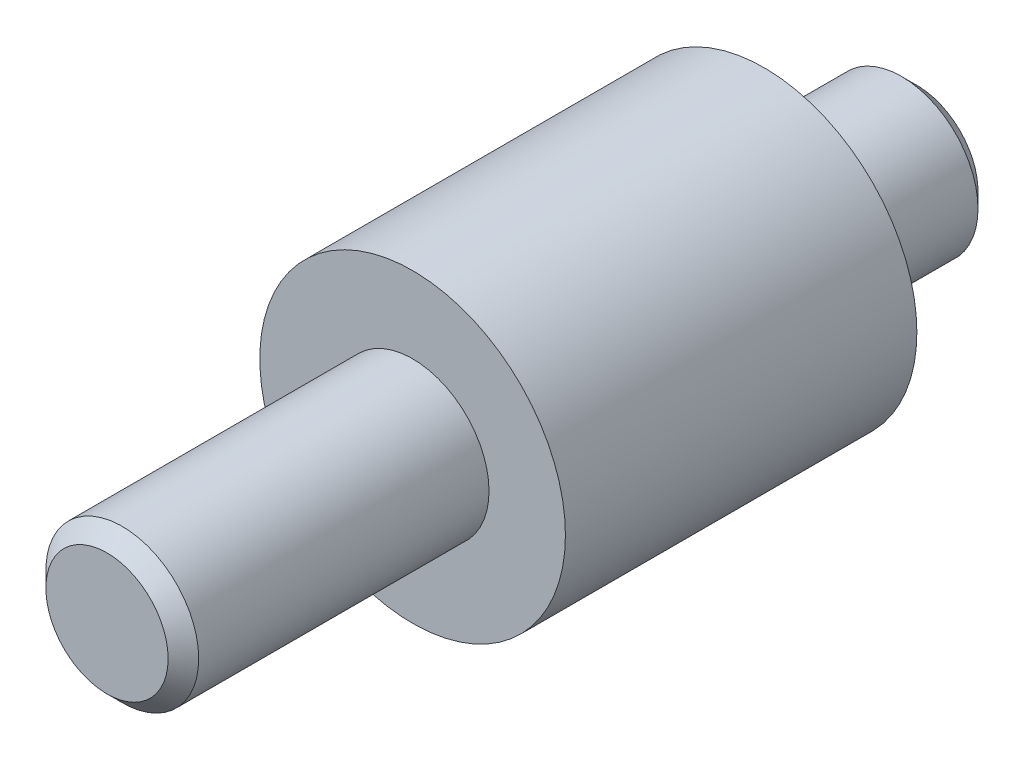
ISO-10303-21;
HEADER;
FILE_DESCRIPTION(('STEP AP214'),'2;1');
FILE_NAME('part.step','',(''),(''),'','','');
FILE_SCHEMA(('AUTOMOTIVE_DESIGN { 1 0 10303 214 1 1 1 1 }'));
ENDSEC;
DATA;
#1=APPLICATION_CONTEXT('core data for automotive mechanical design processes');
#2=APPLICATION_PROTOCOL_DEFINITION('international standard','automotive_design',2000,#1);
#3=PRODUCT_CONTEXT('',#1,'mechanical');
#4=PRODUCT('Part','Part','',(#3));
#5=PRODUCT_RELATED_PRODUCT_CATEGORY('part','',(#4));
#6=PRODUCT_DEFINITION_FORMATION('','',#4);
#7=PRODUCT_DEFINITION_CONTEXT('part definition',#1,'design');
#8=PRODUCT_DEFINITION('design','',#6,#7);
#9=PRODUCT_DEFINITION_SHAPE('','',#8);
#10=(LENGTH_UNIT() NAMED_UNIT(*) SI_UNIT(.MILLI.,.METRE.));
#11=(NAMED_UNIT(*) PLANE_ANGLE_UNIT() SI_UNIT($,.RADIAN.));
#12=(NAMED_UNIT(*) SI_UNIT($,.STERADIAN.) SOLID_ANGLE_UNIT());
#13=UNCERTAINTY_MEASURE_WITH_UNIT(LENGTH_MEASURE(1.E-05),#10,'distance_accuracy_value','');
#14=(GEOMETRIC_REPRESENTATION_CONTEXT(3) GLOBAL_UNCERTAINTY_ASSIGNED_CONTEXT((#13)) GLOBAL_UNIT_ASSIGNED_CONTEXT((#10,
#11,#12)) REPRESENTATION_CONTEXT('',''));
#15=CARTESIAN_POINT('',(0.,0.,0.));
#16=DIRECTION('',(0.,0.,1.));
#17=DIRECTION('',(1.,0.,0.));
#18=AXIS2_PLACEMENT_3D('',#15,#16,#17);
#19=CARTESIAN_POINT('',(0.,0.,0.));
#20=DIRECTION('',(0.,0.,1.));
#21=DIRECTION('',(1.,0.,0.));
#22=AXIS2_PLACEMENT_3D('',#19,#20,#21);
#23=PLANE('',#22);
#24=CARTESIAN_POINT('',(0.,0.,0.));
#25=DIRECTION('',(0.,0.,1.));
#26=DIRECTION('',(1.,0.,0.));
#27=AXIS2_PLACEMENT_3D('',#24,#25,#26);
#28=CIRCLE('',#27,10.);
#29=CARTESIAN_POINT('',(10.,0.,0.));
#30=VERTEX_POINT('',#29);
#31=EDGE_CURVE('E56',#30,#30,#28,.T.);
#32=ORIENTED_EDGE('',*,*,#31,.F.);
#33=EDGE_LOOP('',(#32));
#34=FACE_BOUND('',#33,.T.);
#35=CARTESIAN_POINT('',(0.,0.,0.));
#36=DIRECTION('',(0.,0.,1.));
#37=DIRECTION('',(1.,0.,0.));
#38=AXIS2_PLACEMENT_3D('',#35,#36,#37);
#39=CIRCLE('',#38,5.);
#40=CARTESIAN_POINT('',(5.,0.,0.));
#41=VERTEX_POINT('',#40);
#42=EDGE_CURVE('E52',#41,#41,#39,.F.);
#43=ORIENTED_EDGE('',*,*,#42,.F.);
#44=EDGE_LOOP('',(#43));
#45=FACE_BOUND('',#44,.T.);
#46=ADVANCED_FACE('F32',(#34,#45),#23,.F.);
#47=CARTESIAN_POINT('',(0.,0.,23.));
#48=DIRECTION('',(0.,0.,1.));
#49=DIRECTION('',(1.,0.,0.));
#50=AXIS2_PLACEMENT_3D('',#47,#48,#49);
#51=PLANE('',#50);
#52=CARTESIAN_POINT('',(0.,0.,23.));
#53=DIRECTION('',(0.,0.,1.));
#54=DIRECTION('',(1.,0.,0.));
#55=AXIS2_PLACEMENT_3D('',#52,#53,#54);
#56=CIRCLE('',#55,10.);
#57=CARTESIAN_POINT('',(10.,0.,23.));
#58=VERTEX_POINT('',#57);
#59=EDGE_CURVE('E55',#58,#58,#56,.T.);
#60=ORIENTED_EDGE('',*,*,#59,.T.);
#61=EDGE_LOOP('',(#60));
#62=FACE_BOUND('',#61,.T.);
#63=CARTESIAN_POINT('',(0.,0.,23.));
#64=DIRECTION('',(0.,0.,1.));
#65=DIRECTION('',(1.,0.,0.));
#66=AXIS2_PLACEMENT_3D('',#63,#64,#65);
#67=CIRCLE('',#66,5.);
#68=CARTESIAN_POINT('',(5.,0.,23.));
#69=VERTEX_POINT('',#68);
#70=EDGE_CURVE('E59',#69,#69,#67,.T.);
#71=ORIENTED_EDGE('',*,*,#70,.F.);
#72=EDGE_LOOP('',(#71));
#73=FACE_BOUND('',#72,.T.);
#74=ADVANCED_FACE('F67',(#62,#73),#51,.T.);
#75=CARTESIAN_POINT('',(0.,0.,23.));
#76=DIRECTION('',(0.,0.,-1.));
#77=DIRECTION('',(-1.,0.,0.));
#78=AXIS2_PLACEMENT_3D('',#75,#76,#77);
#79=CYLINDRICAL_SURFACE('',#78,10.);
#80=ORIENTED_EDGE('',*,*,#59,.F.);
#81=EDGE_LOOP('',(#80));
#82=FACE_BOUND('',#81,.T.);
#83=ORIENTED_EDGE('',*,*,#31,.T.);
#84=EDGE_LOOP('',(#83));
#85=FACE_BOUND('',#84,.T.);
#86=ADVANCED_FACE('F69',(#82,#85),#79,.T.);
#87=CARTESIAN_POINT('',(0.,0.,43.));
#88=DIRECTION('',(0.,0.,-1.));
#89=DIRECTION('',(-1.,0.,0.));
#90=AXIS2_PLACEMENT_3D('',#87,#88,#89);
#91=CYLINDRICAL_SURFACE('',#90,5.);
#92=CARTESIAN_POINT('',(0.,0.,42.));
#93=DIRECTION('',(0.,0.,1.));
#94=DIRECTION('',(1.,0.,0.));
#95=AXIS2_PLACEMENT_3D('',#92,#93,#94);
#96=CIRCLE('',#95,5.);
#97=CARTESIAN_POINT('',(5.,0.,42.));
#98=VERTEX_POINT('',#97);
#99=EDGE_CURVE('E10',#98,#98,#96,.F.);
#100=ORIENTED_EDGE('',*,*,#99,.T.);
#101=EDGE_LOOP('',(#100));
#102=FACE_BOUND('',#101,.T.);
#103=ORIENTED_EDGE('',*,*,#70,.T.);
#104=EDGE_LOOP('',(#103));
#105=FACE_BOUND('',#104,.T.);
#106=ADVANCED_FACE('F65',(#102,#105),#91,.T.);
#107=CARTESIAN_POINT('',(0.,0.,43.));
#108=DIRECTION('',(0.,0.,1.));
#109=DIRECTION('',(1.,0.,0.));
#110=AXIS2_PLACEMENT_3D('',#107,#108,#109);
#111=PLANE('',#110);
#112=CARTESIAN_POINT('',(0.,0.,43.));
#113=DIRECTION('',(0.,0.,1.));
#114=DIRECTION('',(1.,0.,0.));
#115=AXIS2_PLACEMENT_3D('',#112,#113,#114);
#116=CIRCLE('',#115,4.);
#117=CARTESIAN_POINT('',(4.,0.,43.));
#118=VERTEX_POINT('',#117);
#119=EDGE_CURVE('E39',#118,#118,#116,.T.);
#120=ORIENTED_EDGE('',*,*,#119,.T.);
#121=EDGE_LOOP('',(#120));
#122=FACE_BOUND('',#121,.T.);
#123=ADVANCED_FACE('F100',(#122),#111,.T.);
#124=CARTESIAN_POINT('',(0.,0.,-10.));
#125=DIRECTION('',(0.,0.,1.));
#126=DIRECTION('',(1.,0.,0.));
#127=AXIS2_PLACEMENT_3D('',#124,#125,#126);
#128=CYLINDRICAL_SURFACE('',#127,5.);
#129=CARTESIAN_POINT('',(0.,0.,-9.));
#130=DIRECTION('',(0.,0.,-1.));
#131=DIRECTION('',(-1.,0.,0.));
#132=AXIS2_PLACEMENT_3D('',#129,#130,#131);
#133=CIRCLE('',#132,5.);
#134=CARTESIAN_POINT('',(-5.,0.,-9.));
#135=VERTEX_POINT('',#134);
#136=EDGE_CURVE('E43',#135,#135,#133,.F.);
#137=ORIENTED_EDGE('',*,*,#136,.T.);
#138=EDGE_LOOP('',(#137));
#139=FACE_BOUND('',#138,.T.);
#140=ORIENTED_EDGE('',*,*,#42,.T.);
#141=EDGE_LOOP('',(#140));
#142=FACE_BOUND('',#141,.T.);
#143=ADVANCED_FACE('F91',(#139,#142),#128,.T.);
#144=CARTESIAN_POINT('',(0.,0.,-10.));
#145=DIRECTION('',(0.,0.,-1.));
#146=DIRECTION('',(-1.,0.,0.));
#147=AXIS2_PLACEMENT_3D('',#144,#145,#146);
#148=PLANE('',#147);
#149=CARTESIAN_POINT('',(0.,0.,-10.));
#150=DIRECTION('',(0.,0.,-1.));
#151=DIRECTION('',(-1.,0.,0.));
#152=AXIS2_PLACEMENT_3D('',#149,#150,#151);
#153=CIRCLE('',#152,4.);
#154=CARTESIAN_POINT('',(-4.,0.,-10.));
#155=VERTEX_POINT('',#154);
#156=EDGE_CURVE('E47',#155,#155,#153,.T.);
#157=ORIENTED_EDGE('',*,*,#156,.T.);
#158=EDGE_LOOP('',(#157));
#159=FACE_BOUND('',#158,.T.);
#160=ADVANCED_FACE('F84',(#159),#148,.T.);
#161=CARTESIAN_POINT('',(0.,0.,-10.));
#162=DIRECTION('',(0.,0.,1.));
#163=DIRECTION('',(1.,0.,0.));
#164=AXIS2_PLACEMENT_3D('',#161,#162,#163);
#165=CONICAL_SURFACE('',#164,4.,0.78539816339745);
#166=ORIENTED_EDGE('',*,*,#136,.F.);
#167=EDGE_LOOP('',(#166));
#168=FACE_BOUND('',#167,.T.);
#169=ORIENTED_EDGE('',*,*,#156,.F.);
#170=EDGE_LOOP('',(#169));
#171=FACE_BOUND('',#170,.T.);
#172=ADVANCED_FACE('F82',(#168,#171),#165,.T.);
#173=CARTESIAN_POINT('',(0.,0.,43.));
#174=DIRECTION('',(0.,0.,-1.));
#175=DIRECTION('',(-1.,0.,0.));
#176=AXIS2_PLACEMENT_3D('',#173,#174,#175);
#177=CONICAL_SURFACE('',#176,4.,0.78539816339745);
#178=ORIENTED_EDGE('',*,*,#99,.F.);
#179=EDGE_LOOP('',(#178));
#180=FACE_BOUND('',#179,.T.);
#181=ORIENTED_EDGE('',*,*,#119,.F.);
#182=EDGE_LOOP('',(#181));
#183=FACE_BOUND('',#182,.T.);
#184=ADVANCED_FACE('F34',(#180,#183),#177,.T.);
#185=CLOSED_SHELL('',(#46,#74,#86,#106,#123,#143,#160,#172,#184));
#186=MANIFOLD_SOLID_BREP('B2',#185);
#187=ADVANCED_BREP_SHAPE_REPRESENTATION('',(#18,#186),#14);
#188=SHAPE_DEFINITION_REPRESENTATION(#9,#187);
ENDSEC;
END-ISO-10303-21;
